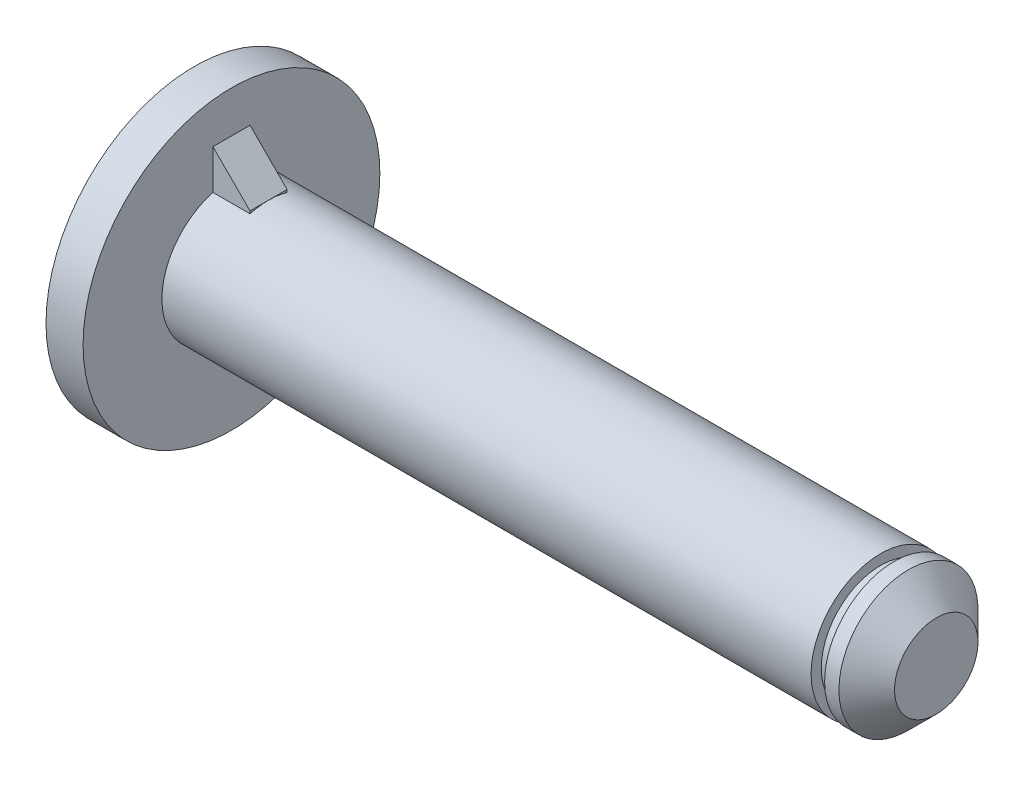
ISO-10303-21;
HEADER;
FILE_DESCRIPTION(('STEP AP214'),'2;1');
FILE_NAME('part.step','',(''),(''),'','','');
FILE_SCHEMA(('AUTOMOTIVE_DESIGN { 1 0 10303 214 1 1 1 1 }'));
ENDSEC;
DATA;
#1=APPLICATION_CONTEXT('core data for automotive mechanical design processes');
#2=APPLICATION_PROTOCOL_DEFINITION('international standard','automotive_design',2000,#1);
#3=PRODUCT_CONTEXT('',#1,'mechanical');
#4=PRODUCT('Part','Part','',(#3));
#5=PRODUCT_RELATED_PRODUCT_CATEGORY('part','',(#4));
#6=PRODUCT_DEFINITION_FORMATION('','',#4);
#7=PRODUCT_DEFINITION_CONTEXT('part definition',#1,'design');
#8=PRODUCT_DEFINITION('design','',#6,#7);
#9=PRODUCT_DEFINITION_SHAPE('','',#8);
#10=(LENGTH_UNIT() NAMED_UNIT(*) SI_UNIT(.MILLI.,.METRE.));
#11=(NAMED_UNIT(*) PLANE_ANGLE_UNIT() SI_UNIT($,.RADIAN.));
#12=(NAMED_UNIT(*) SI_UNIT($,.STERADIAN.) SOLID_ANGLE_UNIT());
#13=UNCERTAINTY_MEASURE_WITH_UNIT(LENGTH_MEASURE(1.E-05),#10,'distance_accuracy_value','');
#14=(GEOMETRIC_REPRESENTATION_CONTEXT(3) GLOBAL_UNCERTAINTY_ASSIGNED_CONTEXT((#13)) GLOBAL_UNIT_ASSIGNED_CONTEXT((#10,
#11,#12)) REPRESENTATION_CONTEXT('',''));
#15=CARTESIAN_POINT('',(0.,0.,0.));
#16=DIRECTION('',(0.,0.,1.));
#17=DIRECTION('',(1.,0.,0.));
#18=AXIS2_PLACEMENT_3D('',#15,#16,#17);
#19=CARTESIAN_POINT('',(-18.,8.,0.));
#20=DIRECTION('',(-1.,0.,0.));
#21=DIRECTION('',(0.,0.,1.));
#22=AXIS2_PLACEMENT_3D('',#19,#20,#21);
#23=PLANE('',#22);
#24=CARTESIAN_POINT('',(-18.,0.,0.));
#25=DIRECTION('',(-1.,0.,0.));
#26=DIRECTION('',(0.,0.,1.));
#27=AXIS2_PLACEMENT_3D('',#24,#25,#26);
#28=CIRCLE('',#27,8.);
#29=CARTESIAN_POINT('',(-18.,0.,8.));
#30=VERTEX_POINT('',#29);
#31=EDGE_CURVE('E128',#30,#30,#28,.T.);
#32=ORIENTED_EDGE('',*,*,#31,.F.);
#33=EDGE_LOOP('',(#32));
#34=FACE_BOUND('',#33,.T.);
#35=DIRECTION('',(0.,-1.,0.));
#36=VECTOR('',#35,1.);
#37=CARTESIAN_POINT('',(-18.,8.,1.));
#38=LINE('',#37,#36);
#39=CARTESIAN_POINT('',(-18.,5.75,1.));
#40=VERTEX_POINT('',#39);
#41=CARTESIAN_POINT('',(-18.,3.61420807370024,1.));
#42=VERTEX_POINT('',#41);
#43=EDGE_CURVE('E114',#40,#42,#38,.T.);
#44=ORIENTED_EDGE('',*,*,#43,.F.);
#45=DIRECTION('',(0.,0.,-1.));
#46=VECTOR('',#45,1.);
#47=CARTESIAN_POINT('',(-18.,5.75,1.));
#48=LINE('',#47,#46);
#49=CARTESIAN_POINT('',(-18.,5.75,-1.));
#50=VERTEX_POINT('',#49);
#51=EDGE_CURVE('E102',#40,#50,#48,.T.);
#52=ORIENTED_EDGE('',*,*,#51,.T.);
#53=DIRECTION('',(0.,-1.,0.));
#54=VECTOR('',#53,1.);
#55=CARTESIAN_POINT('',(-18.,8.,-1.));
#56=LINE('',#55,#54);
#57=CARTESIAN_POINT('',(-18.,3.61420807370024,-1.));
#58=VERTEX_POINT('',#57);
#59=EDGE_CURVE('E98',#50,#58,#56,.T.);
#60=ORIENTED_EDGE('',*,*,#59,.T.);
#61=CARTESIAN_POINT('',(-18.,0.,0.));
#62=DIRECTION('',(-1.,0.,0.));
#63=DIRECTION('',(0.,0.,1.));
#64=AXIS2_PLACEMENT_3D('',#61,#62,#63);
#65=CIRCLE('',#64,3.75);
#66=EDGE_CURVE('E130',#58,#42,#65,.T.);
#67=ORIENTED_EDGE('',*,*,#66,.T.);
#68=EDGE_LOOP('',(#44,#52,#60,#67));
#69=FACE_BOUND('',#68,.T.);
#70=ADVANCED_FACE('F39',(#34,#69),#23,.F.);
#71=CARTESIAN_POINT('',(-20.,0.,0.));
#72=DIRECTION('',(-1.,0.,0.));
#73=DIRECTION('',(0.,0.,1.));
#74=AXIS2_PLACEMENT_3D('',#71,#72,#73);
#75=CYLINDRICAL_SURFACE('',#74,3.75);
#76=CARTESIAN_POINT('',(17.,0.,0.));
#77=DIRECTION('',(-1.,0.,0.));
#78=DIRECTION('',(0.,0.,1.));
#79=AXIS2_PLACEMENT_3D('',#76,#77,#78);
#80=CIRCLE('',#79,3.75);
#81=CARTESIAN_POINT('',(17.,0.,3.75));
#82=VERTEX_POINT('',#81);
#83=EDGE_CURVE('E124',#82,#82,#80,.T.);
#84=ORIENTED_EDGE('',*,*,#83,.T.);
#85=EDGE_LOOP('',(#84));
#86=FACE_BOUND('',#85,.T.);
#87=DIRECTION('',(-1.,0.,0.));
#88=VECTOR('',#87,1.);
#89=CARTESIAN_POINT('',(-20.,3.61420807370024,1.));
#90=LINE('',#89,#88);
#91=CARTESIAN_POINT('',(-16.,3.61420807370024,1.));
#92=VERTEX_POINT('',#91);
#93=EDGE_CURVE('E89',#42,#92,#90,.F.);
#94=ORIENTED_EDGE('',*,*,#93,.F.);
#95=ORIENTED_EDGE('',*,*,#66,.F.);
#96=DIRECTION('',(-1.,0.,0.));
#97=VECTOR('',#96,1.);
#98=CARTESIAN_POINT('',(-20.,3.61420807370024,-1.));
#99=LINE('',#98,#97);
#100=CARTESIAN_POINT('',(-16.,3.61420807370024,-1.));
#101=VERTEX_POINT('',#100);
#102=EDGE_CURVE('E138',#58,#101,#99,.F.);
#103=ORIENTED_EDGE('',*,*,#102,.T.);
#104=CARTESIAN_POINT('',(-16.,0.,0.));
#105=DIRECTION('',(-1.,0.,0.));
#106=DIRECTION('',(0.,0.,1.));
#107=AXIS2_PLACEMENT_3D('',#104,#105,#106);
#108=CIRCLE('',#107,3.75);
#109=CARTESIAN_POINT('',(-16.,3.75,0.));
#110=VERTEX_POINT('',#109);
#111=EDGE_CURVE('E139',#110,#101,#108,.T.);
#112=ORIENTED_EDGE('',*,*,#111,.F.);
#113=EDGE_CURVE('E65',#92,#110,#108,.T.);
#114=ORIENTED_EDGE('',*,*,#113,.F.);
#115=EDGE_LOOP('',(#94,#95,#103,#112,#114));
#116=FACE_BOUND('',#115,.T.);
#117=ADVANCED_FACE('F160',(#86,#116),#75,.T.);
#118=CARTESIAN_POINT('',(-20.,0.,0.));
#119=DIRECTION('',(1.,0.,0.));
#120=DIRECTION('',(0.,0.,-1.));
#121=AXIS2_PLACEMENT_3D('',#118,#119,#120);
#122=PLANE('',#121);
#123=CARTESIAN_POINT('',(-20.,0.,0.));
#124=DIRECTION('',(-1.,0.,0.));
#125=DIRECTION('',(0.,0.,1.));
#126=AXIS2_PLACEMENT_3D('',#123,#124,#125);
#127=CIRCLE('',#126,8.);
#128=CARTESIAN_POINT('',(-20.,0.,8.));
#129=VERTEX_POINT('',#128);
#130=EDGE_CURVE('E134',#129,#129,#127,.T.);
#131=ORIENTED_EDGE('',*,*,#130,.T.);
#132=EDGE_LOOP('',(#131));
#133=FACE_BOUND('',#132,.T.);
#134=ADVANCED_FACE('F163',(#133),#122,.F.);
#135=CARTESIAN_POINT('',(-20.,0.,0.));
#136=DIRECTION('',(-1.,0.,0.));
#137=DIRECTION('',(0.,0.,1.));
#138=AXIS2_PLACEMENT_3D('',#135,#136,#137);
#139=CYLINDRICAL_SURFACE('',#138,8.);
#140=ORIENTED_EDGE('',*,*,#130,.F.);
#141=EDGE_LOOP('',(#140));
#142=FACE_BOUND('',#141,.T.);
#143=ORIENTED_EDGE('',*,*,#31,.T.);
#144=EDGE_LOOP('',(#143));
#145=FACE_BOUND('',#144,.T.);
#146=ADVANCED_FACE('F172',(#142,#145),#139,.T.);
#147=CARTESIAN_POINT('',(17.,3.75,0.));
#148=DIRECTION('',(-1.,0.,0.));
#149=DIRECTION('',(0.,0.,1.));
#150=AXIS2_PLACEMENT_3D('',#147,#148,#149);
#151=PLANE('',#150);
#152=ORIENTED_EDGE('',*,*,#83,.F.);
#153=EDGE_LOOP('',(#152));
#154=FACE_BOUND('',#153,.T.);
#155=CARTESIAN_POINT('',(17.,0.,0.));
#156=DIRECTION('',(-1.,0.,0.));
#157=DIRECTION('',(0.,0.,1.));
#158=AXIS2_PLACEMENT_3D('',#155,#156,#157);
#159=CIRCLE('',#158,3.2);
#160=CARTESIAN_POINT('',(17.,0.,3.2));
#161=VERTEX_POINT('',#160);
#162=EDGE_CURVE('E123',#161,#161,#159,.T.);
#163=ORIENTED_EDGE('',*,*,#162,.T.);
#164=EDGE_LOOP('',(#163));
#165=FACE_BOUND('',#164,.T.);
#166=ADVANCED_FACE('F174',(#154,#165),#151,.F.);
#167=CARTESIAN_POINT('',(-20.,0.,0.));
#168=DIRECTION('',(-1.,0.,0.));
#169=DIRECTION('',(0.,0.,1.));
#170=AXIS2_PLACEMENT_3D('',#167,#168,#169);
#171=CYLINDRICAL_SURFACE('',#170,3.2);
#172=ORIENTED_EDGE('',*,*,#162,.F.);
#173=EDGE_LOOP('',(#172));
#174=FACE_BOUND('',#173,.T.);
#175=CARTESIAN_POINT('',(17.73,0.,0.));
#176=DIRECTION('',(-1.,0.,0.));
#177=DIRECTION('',(0.,0.,1.));
#178=AXIS2_PLACEMENT_3D('',#175,#176,#177);
#179=CIRCLE('',#178,3.2);
#180=CARTESIAN_POINT('',(17.73,0.,3.2));
#181=VERTEX_POINT('',#180);
#182=EDGE_CURVE('E119',#181,#181,#179,.T.);
#183=ORIENTED_EDGE('',*,*,#182,.T.);
#184=EDGE_LOOP('',(#183));
#185=FACE_BOUND('',#184,.T.);
#186=ADVANCED_FACE('F193',(#174,#185),#171,.T.);
#187=CARTESIAN_POINT('',(17.73,3.2,0.));
#188=DIRECTION('',(1.,0.,0.));
#189=DIRECTION('',(0.,0.,-1.));
#190=AXIS2_PLACEMENT_3D('',#187,#188,#189);
#191=PLANE('',#190);
#192=ORIENTED_EDGE('',*,*,#182,.F.);
#193=EDGE_LOOP('',(#192));
#194=FACE_BOUND('',#193,.T.);
#195=CARTESIAN_POINT('',(17.73,0.,0.));
#196=DIRECTION('',(-1.,0.,0.));
#197=DIRECTION('',(0.,0.,1.));
#198=AXIS2_PLACEMENT_3D('',#195,#196,#197);
#199=CIRCLE('',#198,3.75);
#200=CARTESIAN_POINT('',(17.73,0.,3.75));
#201=VERTEX_POINT('',#200);
#202=EDGE_CURVE('E113',#201,#201,#199,.T.);
#203=ORIENTED_EDGE('',*,*,#202,.T.);
#204=EDGE_LOOP('',(#203));
#205=FACE_BOUND('',#204,.T.);
#206=ADVANCED_FACE('F197',(#194,#205),#191,.F.);
#207=CARTESIAN_POINT('',(-20.,0.,0.));
#208=DIRECTION('',(-1.,0.,0.));
#209=DIRECTION('',(0.,0.,1.));
#210=AXIS2_PLACEMENT_3D('',#207,#208,#209);
#211=CYLINDRICAL_SURFACE('',#210,3.75);
#212=CARTESIAN_POINT('',(18.5,0.,0.));
#213=DIRECTION('',(-1.,0.,0.));
#214=DIRECTION('',(0.,0.,1.));
#215=AXIS2_PLACEMENT_3D('',#212,#213,#214);
#216=CIRCLE('',#215,3.75);
#217=CARTESIAN_POINT('',(18.5,0.,3.75));
#218=VERTEX_POINT('',#217);
#219=EDGE_CURVE('E50',#218,#218,#216,.T.);
#220=ORIENTED_EDGE('',*,*,#219,.T.);
#221=EDGE_LOOP('',(#220));
#222=FACE_BOUND('',#221,.T.);
#223=ORIENTED_EDGE('',*,*,#202,.F.);
#224=EDGE_LOOP('',(#223));
#225=FACE_BOUND('',#224,.T.);
#226=ADVANCED_FACE('F145',(#222,#225),#211,.T.);
#227=CARTESIAN_POINT('',(20.,3.75,0.));
#228=DIRECTION('',(-1.,0.,0.));
#229=DIRECTION('',(0.,0.,1.));
#230=AXIS2_PLACEMENT_3D('',#227,#228,#229);
#231=PLANE('',#230);
#232=CARTESIAN_POINT('',(20.,0.,0.));
#233=DIRECTION('',(-1.,0.,0.));
#234=DIRECTION('',(0.,0.,1.));
#235=AXIS2_PLACEMENT_3D('',#232,#233,#234);
#236=CIRCLE('',#235,2.24999999999999);
#237=CARTESIAN_POINT('',(20.,0.,2.24999999999999));
#238=VERTEX_POINT('',#237);
#239=EDGE_CURVE('E11',#238,#238,#236,.F.);
#240=ORIENTED_EDGE('',*,*,#239,.T.);
#241=EDGE_LOOP('',(#240));
#242=FACE_BOUND('',#241,.T.);
#243=ADVANCED_FACE('F213',(#242),#231,.F.);
#244=CARTESIAN_POINT('',(-16.,3.75,1.));
#245=DIRECTION('',(-1.,0.,0.));
#246=DIRECTION('',(0.,0.,1.));
#247=AXIS2_PLACEMENT_3D('',#244,#245,#246);
#248=PLANE('',#247);
#249=DIRECTION('',(0.,1.,0.));
#250=VECTOR('',#249,1.);
#251=CARTESIAN_POINT('',(-16.,3.75,1.));
#252=LINE('',#251,#250);
#253=CARTESIAN_POINT('',(-16.,3.75,1.));
#254=VERTEX_POINT('',#253);
#255=EDGE_CURVE('E84',#92,#254,#252,.T.);
#256=ORIENTED_EDGE('',*,*,#255,.F.);
#257=ORIENTED_EDGE('',*,*,#113,.T.);
#258=DIRECTION('',(0.,0.,-1.));
#259=VECTOR('',#258,1.);
#260=CARTESIAN_POINT('',(-16.,3.75,1.));
#261=LINE('',#260,#259);
#262=EDGE_CURVE('E94',#254,#110,#261,.T.);
#263=ORIENTED_EDGE('',*,*,#262,.F.);
#264=EDGE_LOOP('',(#256,#257,#263));
#265=FACE_BOUND('',#264,.T.);
#266=ADVANCED_FACE('F92',(#265),#248,.F.);
#267=CARTESIAN_POINT('',(0.,0.,1.));
#268=DIRECTION('',(0.,0.,-1.));
#269=DIRECTION('',(-1.,0.,0.));
#270=AXIS2_PLACEMENT_3D('',#267,#268,#269);
#271=PLANE('',#270);
#272=DIRECTION('',(-0.707106781186548,0.707106781186547,0.));
#273=VECTOR('',#272,1.);
#274=CARTESIAN_POINT('',(-18.,5.75,1.));
#275=LINE('',#274,#273);
#276=EDGE_CURVE('E87',#254,#40,#275,.T.);
#277=ORIENTED_EDGE('',*,*,#276,.T.);
#278=ORIENTED_EDGE('',*,*,#43,.T.);
#279=ORIENTED_EDGE('',*,*,#93,.T.);
#280=ORIENTED_EDGE('',*,*,#255,.T.);
#281=EDGE_LOOP('',(#277,#278,#279,#280));
#282=FACE_BOUND('',#281,.T.);
#283=ADVANCED_FACE('F82',(#282),#271,.F.);
#284=CARTESIAN_POINT('',(0.,0.,-1.));
#285=DIRECTION('',(0.,0.,-1.));
#286=DIRECTION('',(-1.,0.,0.));
#287=AXIS2_PLACEMENT_3D('',#284,#285,#286);
#288=PLANE('',#287);
#289=ORIENTED_EDGE('',*,*,#59,.F.);
#290=DIRECTION('',(-0.707106781186548,0.707106781186547,0.));
#291=VECTOR('',#290,1.);
#292=CARTESIAN_POINT('',(-18.,5.75,-1.));
#293=LINE('',#292,#291);
#294=CARTESIAN_POINT('',(-16.,3.75,-1.));
#295=VERTEX_POINT('',#294);
#296=EDGE_CURVE('E93',#295,#50,#293,.T.);
#297=ORIENTED_EDGE('',*,*,#296,.F.);
#298=DIRECTION('',(0.,1.,0.));
#299=VECTOR('',#298,1.);
#300=CARTESIAN_POINT('',(-16.,3.75,-1.));
#301=LINE('',#300,#299);
#302=EDGE_CURVE('E53',#101,#295,#301,.T.);
#303=ORIENTED_EDGE('',*,*,#302,.F.);
#304=ORIENTED_EDGE('',*,*,#102,.F.);
#305=EDGE_LOOP('',(#289,#297,#303,#304));
#306=FACE_BOUND('',#305,.T.);
#307=ADVANCED_FACE('F236',(#306),#288,.T.);
#308=EDGE_CURVE('E97',#110,#295,#261,.T.);
#309=ORIENTED_EDGE('',*,*,#308,.F.);
#310=ORIENTED_EDGE('',*,*,#111,.T.);
#311=ORIENTED_EDGE('',*,*,#302,.T.);
#312=EDGE_LOOP('',(#309,#310,#311));
#313=FACE_BOUND('',#312,.T.);
#314=ADVANCED_FACE('F153',(#313),#248,.F.);
#315=CARTESIAN_POINT('',(-18.,5.75,1.));
#316=DIRECTION('',(-0.707106781186547,-0.707106781186548,0.));
#317=DIRECTION('',(0.707106781186548,-0.707106781186547,0.));
#318=AXIS2_PLACEMENT_3D('',#315,#316,#317);
#319=PLANE('',#318);
#320=ORIENTED_EDGE('',*,*,#296,.T.);
#321=ORIENTED_EDGE('',*,*,#51,.F.);
#322=ORIENTED_EDGE('',*,*,#276,.F.);
#323=ORIENTED_EDGE('',*,*,#262,.T.);
#324=ORIENTED_EDGE('',*,*,#308,.T.);
#325=EDGE_LOOP('',(#320,#321,#322,#323,#324));
#326=FACE_BOUND('',#325,.T.);
#327=ADVANCED_FACE('F105',(#326),#319,.F.);
#328=CARTESIAN_POINT('',(18.5,0.,0.));
#329=DIRECTION('',(-1.,0.,0.));
#330=DIRECTION('',(0.,0.,1.));
#331=AXIS2_PLACEMENT_3D('',#328,#329,#330);
#332=CONICAL_SURFACE('',#331,3.75,0.785398163397453);
#333=ORIENTED_EDGE('',*,*,#239,.F.);
#334=EDGE_LOOP('',(#333));
#335=FACE_BOUND('',#334,.T.);
#336=ORIENTED_EDGE('',*,*,#219,.F.);
#337=EDGE_LOOP('',(#336));
#338=FACE_BOUND('',#337,.T.);
#339=ADVANCED_FACE('F41',(#335,#338),#332,.T.);
#340=CLOSED_SHELL('',(#70,#117,#134,#146,#166,#186,#206,#226,#243,#266,#283,#307,#314,#327,#339));
#341=MANIFOLD_SOLID_BREP('B2',#340);
#342=ADVANCED_BREP_SHAPE_REPRESENTATION('',(#18,#341),#14);
#343=SHAPE_DEFINITION_REPRESENTATION(#9,#342);
ENDSEC;
END-ISO-10303-21;
